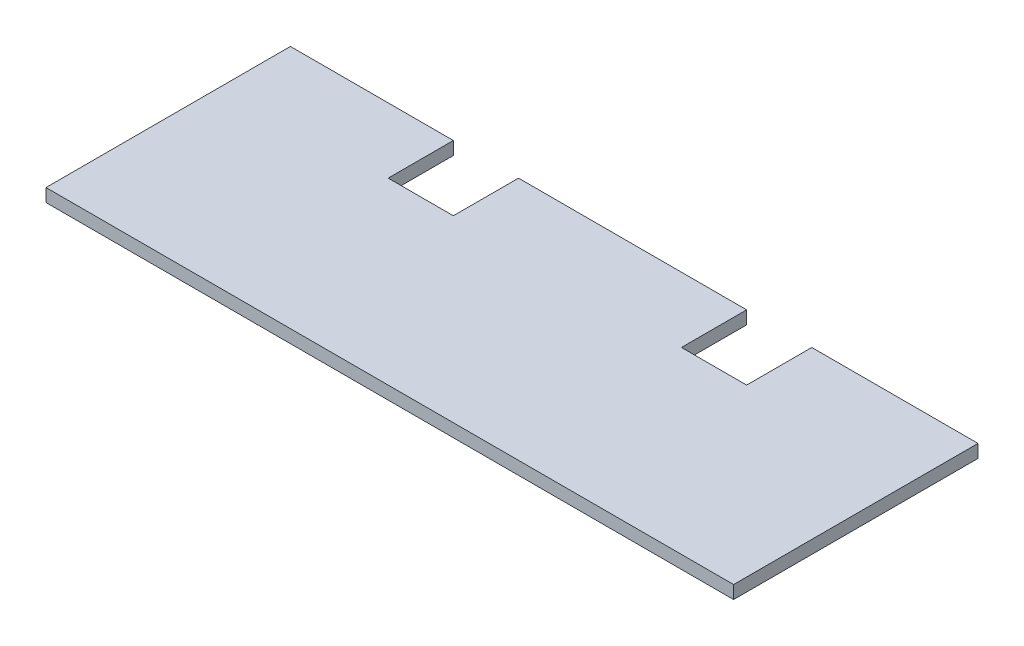
ISO-10303-21;
HEADER;
FILE_DESCRIPTION(('STEP AP214'),'2;1');
FILE_NAME('part.step','',(''),(''),'','','');
FILE_SCHEMA(('AUTOMOTIVE_DESIGN { 1 0 10303 214 1 1 1 1 }'));
ENDSEC;
DATA;
#1=APPLICATION_CONTEXT('core data for automotive mechanical design processes');
#2=APPLICATION_PROTOCOL_DEFINITION('international standard','automotive_design',2000,#1);
#3=PRODUCT_CONTEXT('',#1,'mechanical');
#4=PRODUCT('Part','Part','',(#3));
#5=PRODUCT_RELATED_PRODUCT_CATEGORY('part','',(#4));
#6=PRODUCT_DEFINITION_FORMATION('','',#4);
#7=PRODUCT_DEFINITION_CONTEXT('part definition',#1,'design');
#8=PRODUCT_DEFINITION('design','',#6,#7);
#9=PRODUCT_DEFINITION_SHAPE('','',#8);
#10=(LENGTH_UNIT() NAMED_UNIT(*) SI_UNIT(.MILLI.,.METRE.));
#11=(NAMED_UNIT(*) PLANE_ANGLE_UNIT() SI_UNIT($,.RADIAN.));
#12=(NAMED_UNIT(*) SI_UNIT($,.STERADIAN.) SOLID_ANGLE_UNIT());
#13=UNCERTAINTY_MEASURE_WITH_UNIT(LENGTH_MEASURE(1.E-05),#10,'distance_accuracy_value','');
#14=(GEOMETRIC_REPRESENTATION_CONTEXT(3) GLOBAL_UNCERTAINTY_ASSIGNED_CONTEXT((#13)) GLOBAL_UNIT_ASSIGNED_CONTEXT((#10,
#11,#12)) REPRESENTATION_CONTEXT('',''));
#15=CARTESIAN_POINT('',(0.,0.,0.));
#16=DIRECTION('',(0.,0.,1.));
#17=DIRECTION('',(1.,0.,0.));
#18=AXIS2_PLACEMENT_3D('',#15,#16,#17);
#19=CARTESIAN_POINT('',(-105.5,4.,-37.5));
#20=DIRECTION('',(0.,0.,1.));
#21=DIRECTION('',(1.,0.,0.));
#22=AXIS2_PLACEMENT_3D('',#19,#20,#21);
#23=PLANE('',#22);
#24=DIRECTION('',(-1.,0.,0.));
#25=VECTOR('',#24,1.);
#26=CARTESIAN_POINT('',(-105.5,4.,-37.5));
#27=LINE('',#26,#25);
#28=CARTESIAN_POINT('',(34.5,4.,-37.5));
#29=VERTEX_POINT('',#28);
#30=CARTESIAN_POINT('',(-35.5,4.,-37.5));
#31=VERTEX_POINT('',#30);
#32=EDGE_CURVE('E189',#29,#31,#27,.T.);
#33=ORIENTED_EDGE('',*,*,#32,.F.);
#34=DIRECTION('',(0.,1.,0.));
#35=VECTOR('',#34,1.);
#36=CARTESIAN_POINT('',(34.5,-0.00100000000000013,-37.5));
#37=LINE('',#36,#35);
#38=CARTESIAN_POINT('',(34.5,0.,-37.5));
#39=VERTEX_POINT('',#38);
#40=EDGE_CURVE('E139',#39,#29,#37,.T.);
#41=ORIENTED_EDGE('',*,*,#40,.F.);
#42=DIRECTION('',(-1.,0.,0.));
#43=VECTOR('',#42,1.);
#44=CARTESIAN_POINT('',(-105.5,0.,-37.5));
#45=LINE('',#44,#43);
#46=CARTESIAN_POINT('',(-35.5,0.,-37.5));
#47=VERTEX_POINT('',#46);
#48=EDGE_CURVE('E155',#39,#47,#45,.T.);
#49=ORIENTED_EDGE('',*,*,#48,.T.);
#50=DIRECTION('',(0.,1.,0.));
#51=VECTOR('',#50,1.);
#52=CARTESIAN_POINT('',(-35.5,-0.00100000000000013,-37.5));
#53=LINE('',#52,#51);
#54=EDGE_CURVE('E176',#47,#31,#53,.T.);
#55=ORIENTED_EDGE('',*,*,#54,.T.);
#56=EDGE_LOOP('',(#33,#41,#49,#55));
#57=FACE_BOUND('',#56,.T.);
#58=ADVANCED_FACE('F39',(#57),#23,.F.);
#59=CARTESIAN_POINT('',(105.5,0.,-37.5));
#60=VERTEX_POINT('',#59);
#61=CARTESIAN_POINT('',(54.5,0.,-37.5));
#62=VERTEX_POINT('',#61);
#63=EDGE_CURVE('E145',#60,#62,#45,.T.);
#64=ORIENTED_EDGE('',*,*,#63,.T.);
#65=DIRECTION('',(0.,1.,0.));
#66=VECTOR('',#65,1.);
#67=CARTESIAN_POINT('',(54.5,-0.00100000000000013,-37.5));
#68=LINE('',#67,#66);
#69=CARTESIAN_POINT('',(54.5,4.,-37.5));
#70=VERTEX_POINT('',#69);
#71=EDGE_CURVE('E128',#62,#70,#68,.T.);
#72=ORIENTED_EDGE('',*,*,#71,.T.);
#73=CARTESIAN_POINT('',(105.5,4.,-37.5));
#74=VERTEX_POINT('',#73);
#75=EDGE_CURVE('E186',#74,#70,#27,.T.);
#76=ORIENTED_EDGE('',*,*,#75,.F.);
#77=DIRECTION('',(0.,-1.,0.));
#78=VECTOR('',#77,1.);
#79=CARTESIAN_POINT('',(105.5,4.,-37.5));
#80=LINE('',#79,#78);
#81=EDGE_CURVE('E11',#74,#60,#80,.T.);
#82=ORIENTED_EDGE('',*,*,#81,.T.);
#83=EDGE_LOOP('',(#64,#72,#76,#82));
#84=FACE_BOUND('',#83,.T.);
#85=ADVANCED_FACE('F150',(#84),#23,.F.);
#86=CARTESIAN_POINT('',(105.5,4.,37.5));
#87=DIRECTION('',(-1.,0.,0.));
#88=DIRECTION('',(0.,0.,1.));
#89=AXIS2_PLACEMENT_3D('',#86,#87,#88);
#90=PLANE('',#89);
#91=DIRECTION('',(0.,0.,-1.));
#92=VECTOR('',#91,1.);
#93=CARTESIAN_POINT('',(105.5,0.,37.5));
#94=LINE('',#93,#92);
#95=CARTESIAN_POINT('',(105.5,0.,37.5));
#96=VERTEX_POINT('',#95);
#97=EDGE_CURVE('E164',#96,#60,#94,.T.);
#98=ORIENTED_EDGE('',*,*,#97,.T.);
#99=ORIENTED_EDGE('',*,*,#81,.F.);
#100=DIRECTION('',(0.,0.,-1.));
#101=VECTOR('',#100,1.);
#102=CARTESIAN_POINT('',(105.5,4.,37.5));
#103=LINE('',#102,#101);
#104=CARTESIAN_POINT('',(105.5,4.,37.5));
#105=VERTEX_POINT('',#104);
#106=EDGE_CURVE('E191',#105,#74,#103,.T.);
#107=ORIENTED_EDGE('',*,*,#106,.F.);
#108=DIRECTION('',(0.,-1.,0.));
#109=VECTOR('',#108,1.);
#110=CARTESIAN_POINT('',(105.5,4.,37.5));
#111=LINE('',#110,#109);
#112=EDGE_CURVE('E182',#105,#96,#111,.T.);
#113=ORIENTED_EDGE('',*,*,#112,.T.);
#114=EDGE_LOOP('',(#98,#99,#107,#113));
#115=FACE_BOUND('',#114,.T.);
#116=ADVANCED_FACE('F41',(#115),#90,.F.);
#117=CARTESIAN_POINT('',(-55.5,4.,-37.5));
#118=VERTEX_POINT('',#117);
#119=CARTESIAN_POINT('',(-105.5,4.,-37.5));
#120=VERTEX_POINT('',#119);
#121=EDGE_CURVE('E190',#118,#120,#27,.T.);
#122=ORIENTED_EDGE('',*,*,#121,.F.);
#123=DIRECTION('',(0.,1.,0.));
#124=VECTOR('',#123,1.);
#125=CARTESIAN_POINT('',(-55.5,-0.00100000000000013,-37.5));
#126=LINE('',#125,#124);
#127=CARTESIAN_POINT('',(-55.5,0.,-37.5));
#128=VERTEX_POINT('',#127);
#129=EDGE_CURVE('E195',#128,#118,#126,.T.);
#130=ORIENTED_EDGE('',*,*,#129,.F.);
#131=CARTESIAN_POINT('',(-105.5,0.,-37.5));
#132=VERTEX_POINT('',#131);
#133=EDGE_CURVE('E157',#128,#132,#45,.T.);
#134=ORIENTED_EDGE('',*,*,#133,.T.);
#135=DIRECTION('',(0.,-1.,0.));
#136=VECTOR('',#135,1.);
#137=CARTESIAN_POINT('',(-105.5,4.,-37.5));
#138=LINE('',#137,#136);
#139=EDGE_CURVE('E48',#120,#132,#138,.T.);
#140=ORIENTED_EDGE('',*,*,#139,.F.);
#141=EDGE_LOOP('',(#122,#130,#134,#140));
#142=FACE_BOUND('',#141,.T.);
#143=ADVANCED_FACE('F264',(#142),#23,.F.);
#144=CARTESIAN_POINT('',(-105.5,4.,37.5));
#145=DIRECTION('',(1.,0.,0.));
#146=DIRECTION('',(0.,0.,-1.));
#147=AXIS2_PLACEMENT_3D('',#144,#145,#146);
#148=PLANE('',#147);
#149=DIRECTION('',(0.,0.,1.));
#150=VECTOR('',#149,1.);
#151=CARTESIAN_POINT('',(-105.5,0.,37.5));
#152=LINE('',#151,#150);
#153=CARTESIAN_POINT('',(-105.5,0.,37.5));
#154=VERTEX_POINT('',#153);
#155=EDGE_CURVE('E154',#132,#154,#152,.T.);
#156=ORIENTED_EDGE('',*,*,#155,.T.);
#157=DIRECTION('',(0.,-1.,0.));
#158=VECTOR('',#157,1.);
#159=CARTESIAN_POINT('',(-105.5,4.,37.5));
#160=LINE('',#159,#158);
#161=CARTESIAN_POINT('',(-105.5,4.,37.5));
#162=VERTEX_POINT('',#161);
#163=EDGE_CURVE('E268',#162,#154,#160,.T.);
#164=ORIENTED_EDGE('',*,*,#163,.F.);
#165=DIRECTION('',(0.,0.,1.));
#166=VECTOR('',#165,1.);
#167=CARTESIAN_POINT('',(-105.5,4.,37.5));
#168=LINE('',#167,#166);
#169=EDGE_CURVE('E183',#120,#162,#168,.T.);
#170=ORIENTED_EDGE('',*,*,#169,.F.);
#171=ORIENTED_EDGE('',*,*,#139,.T.);
#172=EDGE_LOOP('',(#156,#164,#170,#171));
#173=FACE_BOUND('',#172,.T.);
#174=ADVANCED_FACE('F269',(#173),#148,.F.);
#175=CARTESIAN_POINT('',(-105.5,4.,37.5));
#176=DIRECTION('',(0.,0.,-1.));
#177=DIRECTION('',(-1.,0.,0.));
#178=AXIS2_PLACEMENT_3D('',#175,#176,#177);
#179=PLANE('',#178);
#180=DIRECTION('',(1.,0.,0.));
#181=VECTOR('',#180,1.);
#182=CARTESIAN_POINT('',(-105.5,0.,37.5));
#183=LINE('',#182,#181);
#184=EDGE_CURVE('E160',#154,#96,#183,.T.);
#185=ORIENTED_EDGE('',*,*,#184,.T.);
#186=ORIENTED_EDGE('',*,*,#112,.F.);
#187=DIRECTION('',(1.,0.,0.));
#188=VECTOR('',#187,1.);
#189=CARTESIAN_POINT('',(-105.5,4.,37.5));
#190=LINE('',#189,#188);
#191=EDGE_CURVE('E179',#162,#105,#190,.T.);
#192=ORIENTED_EDGE('',*,*,#191,.F.);
#193=ORIENTED_EDGE('',*,*,#163,.T.);
#194=EDGE_LOOP('',(#185,#186,#192,#193));
#195=FACE_BOUND('',#194,.T.);
#196=ADVANCED_FACE('F277',(#195),#179,.F.);
#197=CARTESIAN_POINT('',(0.,4.,0.));
#198=DIRECTION('',(0.,-1.,0.));
#199=DIRECTION('',(0.,0.,-1.));
#200=AXIS2_PLACEMENT_3D('',#197,#198,#199);
#201=PLANE('',#200);
#202=DIRECTION('',(1.,0.,0.));
#203=VECTOR('',#202,1.);
#204=CARTESIAN_POINT('',(44.5,4.,-17.5));
#205=LINE('',#204,#203);
#206=CARTESIAN_POINT('',(34.5,4.,-17.5));
#207=VERTEX_POINT('',#206);
#208=CARTESIAN_POINT('',(54.5,4.,-17.5));
#209=VERTEX_POINT('',#208);
#210=EDGE_CURVE('E240',#207,#209,#205,.T.);
#211=ORIENTED_EDGE('',*,*,#210,.F.);
#212=DIRECTION('',(0.,0.,1.));
#213=VECTOR('',#212,1.);
#214=CARTESIAN_POINT('',(34.5,4.,-37.5));
#215=LINE('',#214,#213);
#216=EDGE_CURVE('E229',#29,#207,#215,.T.);
#217=ORIENTED_EDGE('',*,*,#216,.F.);
#218=ORIENTED_EDGE('',*,*,#32,.T.);
#219=DIRECTION('',(0.,0.,-1.));
#220=VECTOR('',#219,1.);
#221=CARTESIAN_POINT('',(-35.5,4.,-21.1732981578742));
#222=LINE('',#221,#220);
#223=CARTESIAN_POINT('',(-35.5,4.,-17.5));
#224=VERTEX_POINT('',#223);
#225=EDGE_CURVE('E198',#224,#31,#222,.T.);
#226=ORIENTED_EDGE('',*,*,#225,.F.);
#227=DIRECTION('',(1.,0.,0.));
#228=VECTOR('',#227,1.);
#229=CARTESIAN_POINT('',(-55.5,4.,-17.5));
#230=LINE('',#229,#228);
#231=CARTESIAN_POINT('',(-55.5,4.,-17.5));
#232=VERTEX_POINT('',#231);
#233=EDGE_CURVE('E210',#232,#224,#230,.T.);
#234=ORIENTED_EDGE('',*,*,#233,.F.);
#235=DIRECTION('',(0.,0.,1.));
#236=VECTOR('',#235,1.);
#237=CARTESIAN_POINT('',(-55.5,4.,-37.5));
#238=LINE('',#237,#236);
#239=EDGE_CURVE('E214',#118,#232,#238,.T.);
#240=ORIENTED_EDGE('',*,*,#239,.F.);
#241=ORIENTED_EDGE('',*,*,#121,.T.);
#242=ORIENTED_EDGE('',*,*,#169,.T.);
#243=ORIENTED_EDGE('',*,*,#191,.T.);
#244=ORIENTED_EDGE('',*,*,#106,.T.);
#245=ORIENTED_EDGE('',*,*,#75,.T.);
#246=DIRECTION('',(0.,0.,-1.));
#247=VECTOR('',#246,1.);
#248=CARTESIAN_POINT('',(54.5,4.,-17.5));
#249=LINE('',#248,#247);
#250=EDGE_CURVE('E134',#209,#70,#249,.T.);
#251=ORIENTED_EDGE('',*,*,#250,.F.);
#252=EDGE_LOOP('',(#211,#217,#218,#226,#234,#240,#241,#242,#243,#244,#245,#251));
#253=FACE_BOUND('',#252,.T.);
#254=ADVANCED_FACE('F260',(#253),#201,.F.);
#255=CARTESIAN_POINT('',(0.,0.,0.));
#256=DIRECTION('',(0.,-1.,0.));
#257=DIRECTION('',(0.,0.,-1.));
#258=AXIS2_PLACEMENT_3D('',#255,#256,#257);
#259=PLANE('',#258);
#260=DIRECTION('',(0.,0.,1.));
#261=VECTOR('',#260,1.);
#262=CARTESIAN_POINT('',(34.5,0.,-37.5));
#263=LINE('',#262,#261);
#264=CARTESIAN_POINT('',(34.5,0.,-17.5));
#265=VERTEX_POINT('',#264);
#266=EDGE_CURVE('E148',#39,#265,#263,.T.);
#267=ORIENTED_EDGE('',*,*,#266,.T.);
#268=DIRECTION('',(1.,0.,0.));
#269=VECTOR('',#268,1.);
#270=CARTESIAN_POINT('',(44.5,0.,-17.5));
#271=LINE('',#270,#269);
#272=CARTESIAN_POINT('',(54.5,0.,-17.5));
#273=VERTEX_POINT('',#272);
#274=EDGE_CURVE('E146',#265,#273,#271,.T.);
#275=ORIENTED_EDGE('',*,*,#274,.T.);
#276=DIRECTION('',(0.,0.,-1.));
#277=VECTOR('',#276,1.);
#278=CARTESIAN_POINT('',(54.5,0.,-17.5));
#279=LINE('',#278,#277);
#280=EDGE_CURVE('E131',#273,#62,#279,.T.);
#281=ORIENTED_EDGE('',*,*,#280,.T.);
#282=ORIENTED_EDGE('',*,*,#63,.F.);
#283=ORIENTED_EDGE('',*,*,#97,.F.);
#284=ORIENTED_EDGE('',*,*,#184,.F.);
#285=ORIENTED_EDGE('',*,*,#155,.F.);
#286=ORIENTED_EDGE('',*,*,#133,.F.);
#287=DIRECTION('',(0.,0.,1.));
#288=VECTOR('',#287,1.);
#289=CARTESIAN_POINT('',(-55.5,0.,-37.5));
#290=LINE('',#289,#288);
#291=CARTESIAN_POINT('',(-55.5,0.,-17.5));
#292=VERTEX_POINT('',#291);
#293=EDGE_CURVE('E171',#128,#292,#290,.T.);
#294=ORIENTED_EDGE('',*,*,#293,.T.);
#295=DIRECTION('',(1.,0.,0.));
#296=VECTOR('',#295,1.);
#297=CARTESIAN_POINT('',(-55.5,0.,-17.5));
#298=LINE('',#297,#296);
#299=CARTESIAN_POINT('',(-35.5,0.,-17.5));
#300=VERTEX_POINT('',#299);
#301=EDGE_CURVE('E221',#292,#300,#298,.T.);
#302=ORIENTED_EDGE('',*,*,#301,.T.);
#303=DIRECTION('',(0.,0.,-1.));
#304=VECTOR('',#303,1.);
#305=CARTESIAN_POINT('',(-35.5,0.,-21.1732981578742));
#306=LINE('',#305,#304);
#307=EDGE_CURVE('E217',#300,#47,#306,.T.);
#308=ORIENTED_EDGE('',*,*,#307,.T.);
#309=ORIENTED_EDGE('',*,*,#48,.F.);
#310=EDGE_LOOP('',(#267,#275,#281,#282,#283,#284,#285,#286,#294,#302,#308,#309));
#311=FACE_BOUND('',#310,.T.);
#312=ADVANCED_FACE('F143',(#311),#259,.T.);
#313=CARTESIAN_POINT('',(-35.5,-0.00100000000000013,-21.1732981578742));
#314=DIRECTION('',(1.,0.,0.));
#315=DIRECTION('',(0.,0.,-1.));
#316=AXIS2_PLACEMENT_3D('',#313,#314,#315);
#317=PLANE('',#316);
#318=DIRECTION('',(0.,1.,0.));
#319=VECTOR('',#318,1.);
#320=CARTESIAN_POINT('',(-35.5,-0.00100000000000013,-17.5));
#321=LINE('',#320,#319);
#322=EDGE_CURVE('E201',#300,#224,#321,.T.);
#323=ORIENTED_EDGE('',*,*,#322,.T.);
#324=ORIENTED_EDGE('',*,*,#225,.T.);
#325=ORIENTED_EDGE('',*,*,#54,.F.);
#326=ORIENTED_EDGE('',*,*,#307,.F.);
#327=EDGE_LOOP('',(#323,#324,#325,#326));
#328=FACE_BOUND('',#327,.T.);
#329=ADVANCED_FACE('F294',(#328),#317,.F.);
#330=CARTESIAN_POINT('',(-55.5,-0.00100000000000013,-17.5));
#331=DIRECTION('',(0.,0.,1.));
#332=DIRECTION('',(1.,0.,0.));
#333=AXIS2_PLACEMENT_3D('',#330,#331,#332);
#334=PLANE('',#333);
#335=DIRECTION('',(0.,1.,0.));
#336=VECTOR('',#335,1.);
#337=CARTESIAN_POINT('',(-55.5,-0.00100000000000013,-17.5));
#338=LINE('',#337,#336);
#339=EDGE_CURVE('E63',#292,#232,#338,.T.);
#340=ORIENTED_EDGE('',*,*,#339,.T.);
#341=ORIENTED_EDGE('',*,*,#233,.T.);
#342=ORIENTED_EDGE('',*,*,#322,.F.);
#343=ORIENTED_EDGE('',*,*,#301,.F.);
#344=EDGE_LOOP('',(#340,#341,#342,#343));
#345=FACE_BOUND('',#344,.T.);
#346=ADVANCED_FACE('F300',(#345),#334,.F.);
#347=CARTESIAN_POINT('',(-55.5,-0.00100000000000013,-37.5));
#348=DIRECTION('',(-1.,0.,0.));
#349=DIRECTION('',(0.,0.,1.));
#350=AXIS2_PLACEMENT_3D('',#347,#348,#349);
#351=PLANE('',#350);
#352=ORIENTED_EDGE('',*,*,#129,.T.);
#353=ORIENTED_EDGE('',*,*,#239,.T.);
#354=ORIENTED_EDGE('',*,*,#339,.F.);
#355=ORIENTED_EDGE('',*,*,#293,.F.);
#356=EDGE_LOOP('',(#352,#353,#354,#355));
#357=FACE_BOUND('',#356,.T.);
#358=ADVANCED_FACE('F297',(#357),#351,.F.);
#359=CARTESIAN_POINT('',(34.5,-0.00100000000000013,-37.5));
#360=DIRECTION('',(-1.,0.,0.));
#361=DIRECTION('',(0.,0.,1.));
#362=AXIS2_PLACEMENT_3D('',#359,#360,#361);
#363=PLANE('',#362);
#364=ORIENTED_EDGE('',*,*,#40,.T.);
#365=ORIENTED_EDGE('',*,*,#216,.T.);
#366=DIRECTION('',(0.,1.,0.));
#367=VECTOR('',#366,1.);
#368=CARTESIAN_POINT('',(34.5,-0.00100000000000013,-17.5));
#369=LINE('',#368,#367);
#370=EDGE_CURVE('E227',#265,#207,#369,.T.);
#371=ORIENTED_EDGE('',*,*,#370,.F.);
#372=ORIENTED_EDGE('',*,*,#266,.F.);
#373=EDGE_LOOP('',(#364,#365,#371,#372));
#374=FACE_BOUND('',#373,.T.);
#375=ADVANCED_FACE('F248',(#374),#363,.F.);
#376=CARTESIAN_POINT('',(54.5,-0.00100000000000013,-17.5));
#377=DIRECTION('',(1.,0.,0.));
#378=DIRECTION('',(0.,0.,-1.));
#379=AXIS2_PLACEMENT_3D('',#376,#377,#378);
#380=PLANE('',#379);
#381=DIRECTION('',(0.,1.,0.));
#382=VECTOR('',#381,1.);
#383=CARTESIAN_POINT('',(54.5,-0.00100000000000013,-17.5));
#384=LINE('',#383,#382);
#385=EDGE_CURVE('E55',#273,#209,#384,.T.);
#386=ORIENTED_EDGE('',*,*,#385,.T.);
#387=ORIENTED_EDGE('',*,*,#250,.T.);
#388=ORIENTED_EDGE('',*,*,#71,.F.);
#389=ORIENTED_EDGE('',*,*,#280,.F.);
#390=EDGE_LOOP('',(#386,#387,#388,#389));
#391=FACE_BOUND('',#390,.T.);
#392=ADVANCED_FACE('F130',(#391),#380,.F.);
#393=CARTESIAN_POINT('',(44.5,-0.00100000000000013,-17.5));
#394=DIRECTION('',(0.,0.,1.));
#395=DIRECTION('',(1.,0.,0.));
#396=AXIS2_PLACEMENT_3D('',#393,#394,#395);
#397=PLANE('',#396);
#398=ORIENTED_EDGE('',*,*,#370,.T.);
#399=ORIENTED_EDGE('',*,*,#210,.T.);
#400=ORIENTED_EDGE('',*,*,#385,.F.);
#401=ORIENTED_EDGE('',*,*,#274,.F.);
#402=EDGE_LOOP('',(#398,#399,#400,#401));
#403=FACE_BOUND('',#402,.T.);
#404=ADVANCED_FACE('F307',(#403),#397,.F.);
#405=CLOSED_SHELL('',(#58,#85,#116,#143,#174,#196,#254,#312,#329,#346,#358,#375,#392,#404));
#406=MANIFOLD_SOLID_BREP('B2',#405);
#407=ADVANCED_BREP_SHAPE_REPRESENTATION('',(#18,#406),#14);
#408=SHAPE_DEFINITION_REPRESENTATION(#9,#407);
ENDSEC;
END-ISO-10303-21;
